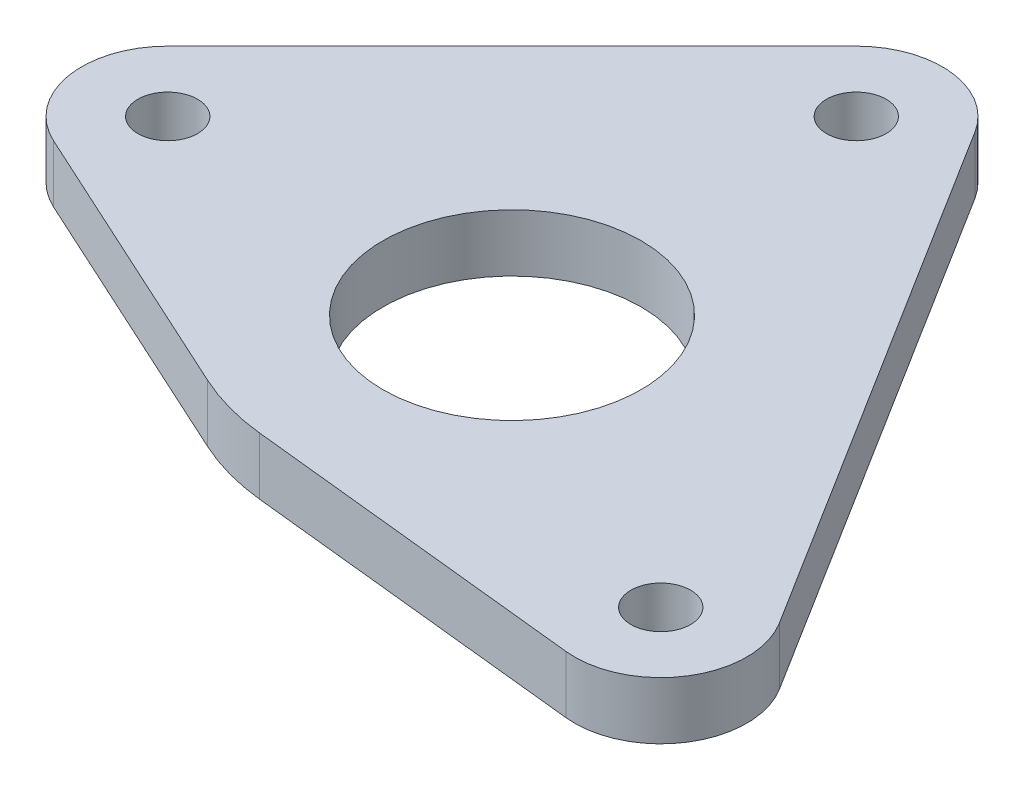
ISO-10303-21;
HEADER;
FILE_DESCRIPTION(('STEP AP214'),'2;1');
FILE_NAME('part.step','',(''),(''),'','','');
FILE_SCHEMA(('AUTOMOTIVE_DESIGN { 1 0 10303 214 1 1 1 1 }'));
ENDSEC;
DATA;
#1=APPLICATION_CONTEXT('core data for automotive mechanical design processes');
#2=APPLICATION_PROTOCOL_DEFINITION('international standard','automotive_design',2000,#1);
#3=PRODUCT_CONTEXT('',#1,'mechanical');
#4=PRODUCT('Part','Part','',(#3));
#5=PRODUCT_RELATED_PRODUCT_CATEGORY('part','',(#4));
#6=PRODUCT_DEFINITION_FORMATION('','',#4);
#7=PRODUCT_DEFINITION_CONTEXT('part definition',#1,'design');
#8=PRODUCT_DEFINITION('design','',#6,#7);
#9=PRODUCT_DEFINITION_SHAPE('','',#8);
#10=(LENGTH_UNIT() NAMED_UNIT(*) SI_UNIT(.MILLI.,.METRE.));
#11=(NAMED_UNIT(*) PLANE_ANGLE_UNIT() SI_UNIT($,.RADIAN.));
#12=(NAMED_UNIT(*) SI_UNIT($,.STERADIAN.) SOLID_ANGLE_UNIT());
#13=UNCERTAINTY_MEASURE_WITH_UNIT(LENGTH_MEASURE(1.E-05),#10,'distance_accuracy_value','');
#14=(GEOMETRIC_REPRESENTATION_CONTEXT(3) GLOBAL_UNCERTAINTY_ASSIGNED_CONTEXT((#13)) GLOBAL_UNIT_ASSIGNED_CONTEXT((#10,
#11,#12)) REPRESENTATION_CONTEXT('',''));
#15=CARTESIAN_POINT('',(0.,0.,0.));
#16=DIRECTION('',(0.,0.,1.));
#17=DIRECTION('',(1.,0.,0.));
#18=AXIS2_PLACEMENT_3D('',#15,#16,#17);
#19=CARTESIAN_POINT('',(533.11627146309,-57.15,450.990071462721));
#20=DIRECTION('',(0.,-1.,0.));
#21=DIRECTION('',(0.,0.,-1.));
#22=AXIS2_PLACEMENT_3D('',#19,#20,#21);
#23=PLANE('',#22);
#24=CARTESIAN_POINT('',(495.950567298665,-57.15,460.154340894014));
#25=DIRECTION('',(0.,-1.,0.));
#26=DIRECTION('',(0.,0.,-1.));
#27=AXIS2_PLACEMENT_3D('',#24,#25,#26);
#28=CIRCLE('',#27,9.525);
#29=CARTESIAN_POINT('',(491.981817298665,-57.15,468.813131135006));
#30=VERTEX_POINT('',#29);
#31=CARTESIAN_POINT('',(489.215375207863,-57.15,453.419148803212));
#32=VERTEX_POINT('',#31);
#33=EDGE_CURVE('E147',#30,#32,#28,.T.);
#34=ORIENTED_EDGE('',*,*,#33,.F.);
#35=DIRECTION('',(0.909059342886309,0.,0.416666666666668));
#36=VECTOR('',#35,1.);
#37=CARTESIAN_POINT('',(507.724525631999,-57.15,476.028789669166));
#38=LINE('',#37,#36);
#39=CARTESIAN_POINT('',(523.467233965332,-57.15,483.244448203326));
#40=VERTEX_POINT('',#39);
#41=EDGE_CURVE('E25',#30,#40,#38,.T.);
#42=ORIENTED_EDGE('',*,*,#41,.T.);
#43=CARTESIAN_POINT('',(534.050567298665,-57.15,460.154340894014));
#44=DIRECTION('',(0.,-1.,0.));
#45=DIRECTION('',(0.,0.,-1.));
#46=AXIS2_PLACEMENT_3D('',#43,#44,#45);
#47=CIRCLE('',#46,25.4);
#48=CARTESIAN_POINT('',(531.394922706726,-57.15,485.415131693221));
#49=VERTEX_POINT('',#48);
#50=EDGE_CURVE('E217',#49,#40,#47,.T.);
#51=ORIENTED_EDGE('',*,*,#50,.F.);
#52=DIRECTION('',(-0.994519322803428,0.,-0.104552936690518));
#53=VECTOR('',#52,1.);
#54=CARTESIAN_POINT('',(550.340515806131,-57.15,487.406865137175));
#55=LINE('',#54,#53);
#56=CARTESIAN_POINT('',(569.286108905537,-57.15,489.39859858113));
#57=VERTEX_POINT('',#56);
#58=EDGE_CURVE('E227',#57,#49,#55,.T.);
#59=ORIENTED_EDGE('',*,*,#58,.F.);
#60=CARTESIAN_POINT('',(570.281975627514,-57.15,479.925802031427));
#61=DIRECTION('',(0.,-1.,0.));
#62=DIRECTION('',(0.,0.,-1.));
#63=AXIS2_PLACEMENT_3D('',#60,#61,#62);
#64=CIRCLE('',#63,9.525);
#65=CARTESIAN_POINT('',(578.355285771646,-57.15,474.87136948992));
#66=VERTEX_POINT('',#65);
#67=EDGE_CURVE('E168',#66,#57,#64,.T.);
#68=ORIENTED_EDGE('',*,*,#67,.F.);
#69=DIRECTION('',(0.530649085722529,0.,0.847591616181899));
#70=VECTOR('',#69,1.);
#71=CARTESIAN_POINT('',(560.239581607222,-57.15,445.935638921214));
#72=LINE('',#71,#70);
#73=CARTESIAN_POINT('',(542.123877442798,-57.15,416.999908352507));
#74=VERTEX_POINT('',#73);
#75=EDGE_CURVE('E174',#74,#66,#72,.T.);
#76=ORIENTED_EDGE('',*,*,#75,.F.);
#77=CARTESIAN_POINT('',(534.050567298665,-57.15,422.054340894014));
#78=DIRECTION('',(0.,-1.,0.));
#79=DIRECTION('',(0.,0.,-1.));
#80=AXIS2_PLACEMENT_3D('',#77,#78,#79);
#81=CIRCLE('',#80,9.525);
#82=CARTESIAN_POINT('',(527.315375207863,-57.15,415.319148803212));
#83=VERTEX_POINT('',#82);
#84=EDGE_CURVE('E185',#83,#74,#81,.T.);
#85=ORIENTED_EDGE('',*,*,#84,.F.);
#86=DIRECTION('',(0.707106781186548,0.,-0.707106781186547));
#87=VECTOR('',#86,1.);
#88=CARTESIAN_POINT('',(508.265375207863,-57.15,434.369148803212));
#89=LINE('',#88,#87);
#90=EDGE_CURVE('E151',#32,#83,#89,.T.);
#91=ORIENTED_EDGE('',*,*,#90,.F.);
#92=EDGE_LOOP('',(#34,#42,#51,#59,#68,#76,#85,#91));
#93=FACE_BOUND('',#92,.T.);
#94=CARTESIAN_POINT('',(495.950567298665,-57.15,460.154340894014));
#95=DIRECTION('',(0.,-1.,0.));
#96=DIRECTION('',(0.,0.,-1.));
#97=AXIS2_PLACEMENT_3D('',#94,#95,#96);
#98=CIRCLE('',#97,3.302);
#99=CARTESIAN_POINT('',(495.950567298665,-57.15,456.852340894014));
#100=VERTEX_POINT('',#99);
#101=EDGE_CURVE('E216',#100,#100,#98,.T.);
#102=ORIENTED_EDGE('',*,*,#101,.T.);
#103=EDGE_LOOP('',(#102));
#104=FACE_BOUND('',#103,.T.);
#105=CARTESIAN_POINT('',(534.050567298665,-57.15,460.154340894014));
#106=DIRECTION('',(0.,-1.,0.));
#107=DIRECTION('',(0.,0.,-1.));
#108=AXIS2_PLACEMENT_3D('',#105,#106,#107);
#109=CIRCLE('',#108,14.2875);
#110=CARTESIAN_POINT('',(534.050567298665,-57.15,445.866840894014));
#111=VERTEX_POINT('',#110);
#112=EDGE_CURVE('E215',#111,#111,#109,.T.);
#113=ORIENTED_EDGE('',*,*,#112,.T.);
#114=EDGE_LOOP('',(#113));
#115=FACE_BOUND('',#114,.T.);
#116=CARTESIAN_POINT('',(534.050567298665,-57.15,422.054340894014));
#117=DIRECTION('',(0.,-1.,0.));
#118=DIRECTION('',(0.,0.,-1.));
#119=AXIS2_PLACEMENT_3D('',#116,#117,#118);
#120=CIRCLE('',#119,3.302);
#121=CARTESIAN_POINT('',(534.050567298665,-57.15,418.752340894014));
#122=VERTEX_POINT('',#121);
#123=EDGE_CURVE('E247',#122,#122,#120,.T.);
#124=ORIENTED_EDGE('',*,*,#123,.T.);
#125=EDGE_LOOP('',(#124));
#126=FACE_BOUND('',#125,.T.);
#127=CARTESIAN_POINT('',(570.281975627514,-57.15,479.925802031427));
#128=DIRECTION('',(0.,-1.,0.));
#129=DIRECTION('',(0.,0.,-1.));
#130=AXIS2_PLACEMENT_3D('',#127,#128,#129);
#131=CIRCLE('',#130,3.30199999999991);
#132=CARTESIAN_POINT('',(570.281975627514,-57.15,476.623802031427));
#133=VERTEX_POINT('',#132);
#134=EDGE_CURVE('E35',#133,#133,#131,.T.);
#135=ORIENTED_EDGE('',*,*,#134,.T.);
#136=EDGE_LOOP('',(#135));
#137=FACE_BOUND('',#136,.T.);
#138=ADVANCED_FACE('F17',(#93,#104,#115,#126,#137),#23,.F.);
#139=CARTESIAN_POINT('',(533.11627146309,-63.5,450.990071462721));
#140=DIRECTION('',(0.,-1.,0.));
#141=DIRECTION('',(0.,0.,-1.));
#142=AXIS2_PLACEMENT_3D('',#139,#140,#141);
#143=PLANE('',#142);
#144=CARTESIAN_POINT('',(495.950567298665,-63.5,460.154340894014));
#145=DIRECTION('',(0.,-1.,0.));
#146=DIRECTION('',(0.,0.,-1.));
#147=AXIS2_PLACEMENT_3D('',#144,#145,#146);
#148=CIRCLE('',#147,9.525);
#149=CARTESIAN_POINT('',(491.981817298665,-63.5,468.813131135006));
#150=VERTEX_POINT('',#149);
#151=CARTESIAN_POINT('',(489.215375207863,-63.5,453.419148803212));
#152=VERTEX_POINT('',#151);
#153=EDGE_CURVE('E149',#150,#152,#148,.T.);
#154=ORIENTED_EDGE('',*,*,#153,.T.);
#155=DIRECTION('',(0.707106781186548,0.,-0.707106781186547));
#156=VECTOR('',#155,1.);
#157=CARTESIAN_POINT('',(508.265375207863,-63.5,434.369148803212));
#158=LINE('',#157,#156);
#159=CARTESIAN_POINT('',(527.315375207863,-63.5,415.319148803212));
#160=VERTEX_POINT('',#159);
#161=EDGE_CURVE('E190',#152,#160,#158,.T.);
#162=ORIENTED_EDGE('',*,*,#161,.T.);
#163=CARTESIAN_POINT('',(534.050567298665,-63.5,422.054340894014));
#164=DIRECTION('',(0.,-1.,0.));
#165=DIRECTION('',(0.,0.,-1.));
#166=AXIS2_PLACEMENT_3D('',#163,#164,#165);
#167=CIRCLE('',#166,9.525);
#168=CARTESIAN_POINT('',(542.123877442798,-63.5,416.999908352507));
#169=VERTEX_POINT('',#168);
#170=EDGE_CURVE('E179',#160,#169,#167,.T.);
#171=ORIENTED_EDGE('',*,*,#170,.T.);
#172=DIRECTION('',(0.530649085722529,0.,0.847591616181899));
#173=VECTOR('',#172,1.);
#174=CARTESIAN_POINT('',(560.239581607222,-63.5,445.935638921214));
#175=LINE('',#174,#173);
#176=CARTESIAN_POINT('',(578.355285771646,-63.5,474.87136948992));
#177=VERTEX_POINT('',#176);
#178=EDGE_CURVE('E173',#169,#177,#175,.T.);
#179=ORIENTED_EDGE('',*,*,#178,.T.);
#180=CARTESIAN_POINT('',(570.281975627514,-63.5,479.925802031427));
#181=DIRECTION('',(0.,-1.,0.));
#182=DIRECTION('',(0.,0.,-1.));
#183=AXIS2_PLACEMENT_3D('',#180,#181,#182);
#184=CIRCLE('',#183,9.525);
#185=CARTESIAN_POINT('',(569.286108905537,-63.5,489.39859858113));
#186=VERTEX_POINT('',#185);
#187=EDGE_CURVE('E211',#177,#186,#184,.T.);
#188=ORIENTED_EDGE('',*,*,#187,.T.);
#189=DIRECTION('',(-0.994519322803428,0.,-0.104552936690518));
#190=VECTOR('',#189,1.);
#191=CARTESIAN_POINT('',(550.340515806131,-63.5,487.406865137175));
#192=LINE('',#191,#190);
#193=CARTESIAN_POINT('',(531.394922706726,-63.5,485.415131693221));
#194=VERTEX_POINT('',#193);
#195=EDGE_CURVE('E220',#186,#194,#192,.T.);
#196=ORIENTED_EDGE('',*,*,#195,.T.);
#197=CARTESIAN_POINT('',(534.050567298665,-63.5,460.154340894014));
#198=DIRECTION('',(0.,-1.,0.));
#199=DIRECTION('',(0.,0.,-1.));
#200=AXIS2_PLACEMENT_3D('',#197,#198,#199);
#201=CIRCLE('',#200,25.4);
#202=CARTESIAN_POINT('',(523.467233965332,-63.5,483.244448203326));
#203=VERTEX_POINT('',#202);
#204=EDGE_CURVE('E194',#194,#203,#201,.T.);
#205=ORIENTED_EDGE('',*,*,#204,.T.);
#206=DIRECTION('',(0.909059342886309,0.,0.416666666666668));
#207=VECTOR('',#206,1.);
#208=CARTESIAN_POINT('',(507.724525631999,-63.5,476.028789669166));
#209=LINE('',#208,#207);
#210=EDGE_CURVE('E11',#150,#203,#209,.T.);
#211=ORIENTED_EDGE('',*,*,#210,.F.);
#212=EDGE_LOOP('',(#154,#162,#171,#179,#188,#196,#205,#211));
#213=FACE_BOUND('',#212,.T.);
#214=CARTESIAN_POINT('',(495.950567298665,-63.5,460.154340894014));
#215=DIRECTION('',(0.,-1.,0.));
#216=DIRECTION('',(0.,0.,-1.));
#217=AXIS2_PLACEMENT_3D('',#214,#215,#216);
#218=CIRCLE('',#217,3.302);
#219=CARTESIAN_POINT('',(495.950567298665,-63.5,456.852340894014));
#220=VERTEX_POINT('',#219);
#221=EDGE_CURVE('E198',#220,#220,#218,.T.);
#222=ORIENTED_EDGE('',*,*,#221,.F.);
#223=EDGE_LOOP('',(#222));
#224=FACE_BOUND('',#223,.T.);
#225=CARTESIAN_POINT('',(534.050567298665,-63.5,460.154340894014));
#226=DIRECTION('',(0.,-1.,0.));
#227=DIRECTION('',(0.,0.,-1.));
#228=AXIS2_PLACEMENT_3D('',#225,#226,#227);
#229=CIRCLE('',#228,14.2875);
#230=CARTESIAN_POINT('',(534.050567298665,-63.5,445.866840894014));
#231=VERTEX_POINT('',#230);
#232=EDGE_CURVE('E212',#231,#231,#229,.T.);
#233=ORIENTED_EDGE('',*,*,#232,.F.);
#234=EDGE_LOOP('',(#233));
#235=FACE_BOUND('',#234,.T.);
#236=CARTESIAN_POINT('',(534.050567298665,-63.5,422.054340894014));
#237=DIRECTION('',(0.,-1.,0.));
#238=DIRECTION('',(0.,0.,-1.));
#239=AXIS2_PLACEMENT_3D('',#236,#237,#238);
#240=CIRCLE('',#239,3.302);
#241=CARTESIAN_POINT('',(534.050567298665,-63.5,418.752340894014));
#242=VERTEX_POINT('',#241);
#243=EDGE_CURVE('E244',#242,#242,#240,.T.);
#244=ORIENTED_EDGE('',*,*,#243,.F.);
#245=EDGE_LOOP('',(#244));
#246=FACE_BOUND('',#245,.T.);
#247=CARTESIAN_POINT('',(570.281975627514,-63.5,479.925802031427));
#248=DIRECTION('',(0.,-1.,0.));
#249=DIRECTION('',(0.,0.,-1.));
#250=AXIS2_PLACEMENT_3D('',#247,#248,#249);
#251=CIRCLE('',#250,3.30199999999991);
#252=CARTESIAN_POINT('',(570.281975627514,-63.5,476.623802031427));
#253=VERTEX_POINT('',#252);
#254=EDGE_CURVE('E42',#253,#253,#251,.T.);
#255=ORIENTED_EDGE('',*,*,#254,.F.);
#256=EDGE_LOOP('',(#255));
#257=FACE_BOUND('',#256,.T.);
#258=ADVANCED_FACE('F359',(#213,#224,#235,#246,#257),#143,.T.);
#259=CARTESIAN_POINT('',(507.724525631999,-63.5,476.028789669166));
#260=DIRECTION('',(-0.416666666666668,0.,0.909059342886309));
#261=DIRECTION('',(0.,1.,0.));
#262=AXIS2_PLACEMENT_3D('',#259,#260,#261);
#263=PLANE('',#262);
#264=ORIENTED_EDGE('',*,*,#41,.F.);
#265=DIRECTION('',(0.,1.,0.));
#266=VECTOR('',#265,1.);
#267=CARTESIAN_POINT('',(491.981817298665,-63.5,468.813131135006));
#268=LINE('',#267,#266);
#269=EDGE_CURVE('E135',#150,#30,#268,.T.);
#270=ORIENTED_EDGE('',*,*,#269,.F.);
#271=ORIENTED_EDGE('',*,*,#210,.T.);
#272=DIRECTION('',(0.,1.,0.));
#273=VECTOR('',#272,1.);
#274=CARTESIAN_POINT('',(523.467233965332,-63.5,483.244448203326));
#275=LINE('',#274,#273);
#276=EDGE_CURVE('E138',#203,#40,#275,.T.);
#277=ORIENTED_EDGE('',*,*,#276,.T.);
#278=EDGE_LOOP('',(#264,#270,#271,#277));
#279=FACE_BOUND('',#278,.T.);
#280=ADVANCED_FACE('F134',(#279),#263,.T.);
#281=CARTESIAN_POINT('',(570.281975627514,-63.5,479.925802031427));
#282=DIRECTION('',(0.,1.,0.));
#283=DIRECTION('',(0.,0.,1.));
#284=AXIS2_PLACEMENT_3D('',#281,#282,#283);
#285=CYLINDRICAL_SURFACE('',#284,3.30199999999991);
#286=ORIENTED_EDGE('',*,*,#134,.F.);
#287=EDGE_LOOP('',(#286));
#288=FACE_BOUND('',#287,.T.);
#289=ORIENTED_EDGE('',*,*,#254,.T.);
#290=EDGE_LOOP('',(#289));
#291=FACE_BOUND('',#290,.T.);
#292=ADVANCED_FACE('F260',(#288,#291),#285,.F.);
#293=CARTESIAN_POINT('',(534.050567298665,-63.5,422.054340894014));
#294=DIRECTION('',(0.,1.,0.));
#295=DIRECTION('',(0.,0.,1.));
#296=AXIS2_PLACEMENT_3D('',#293,#294,#295);
#297=CYLINDRICAL_SURFACE('',#296,3.302);
#298=ORIENTED_EDGE('',*,*,#123,.F.);
#299=EDGE_LOOP('',(#298));
#300=FACE_BOUND('',#299,.T.);
#301=ORIENTED_EDGE('',*,*,#243,.T.);
#302=EDGE_LOOP('',(#301));
#303=FACE_BOUND('',#302,.T.);
#304=ADVANCED_FACE('F265',(#300,#303),#297,.F.);
#305=CARTESIAN_POINT('',(534.050567298665,-63.5,460.154340894014));
#306=DIRECTION('',(0.,1.,0.));
#307=DIRECTION('',(0.,0.,1.));
#308=AXIS2_PLACEMENT_3D('',#305,#306,#307);
#309=CYLINDRICAL_SURFACE('',#308,14.2875);
#310=ORIENTED_EDGE('',*,*,#112,.F.);
#311=EDGE_LOOP('',(#310));
#312=FACE_BOUND('',#311,.T.);
#313=ORIENTED_EDGE('',*,*,#232,.T.);
#314=EDGE_LOOP('',(#313));
#315=FACE_BOUND('',#314,.T.);
#316=ADVANCED_FACE('F339',(#312,#315),#309,.F.);
#317=CARTESIAN_POINT('',(495.950567298665,-63.5,460.154340894014));
#318=DIRECTION('',(0.,1.,0.));
#319=DIRECTION('',(0.,0.,1.));
#320=AXIS2_PLACEMENT_3D('',#317,#318,#319);
#321=CYLINDRICAL_SURFACE('',#320,3.302);
#322=ORIENTED_EDGE('',*,*,#101,.F.);
#323=EDGE_LOOP('',(#322));
#324=FACE_BOUND('',#323,.T.);
#325=ORIENTED_EDGE('',*,*,#221,.T.);
#326=EDGE_LOOP('',(#325));
#327=FACE_BOUND('',#326,.T.);
#328=ADVANCED_FACE('F330',(#324,#327),#321,.F.);
#329=CARTESIAN_POINT('',(534.050567298665,-63.5,460.154340894014));
#330=DIRECTION('',(0.,1.,0.));
#331=DIRECTION('',(0.,0.,1.));
#332=AXIS2_PLACEMENT_3D('',#329,#330,#331);
#333=CYLINDRICAL_SURFACE('',#332,25.4);
#334=ORIENTED_EDGE('',*,*,#50,.T.);
#335=ORIENTED_EDGE('',*,*,#276,.F.);
#336=ORIENTED_EDGE('',*,*,#204,.F.);
#337=DIRECTION('',(0.,1.,0.));
#338=VECTOR('',#337,1.);
#339=CARTESIAN_POINT('',(531.394922706726,-63.5,485.415131693221));
#340=LINE('',#339,#338);
#341=EDGE_CURVE('E231',#194,#49,#340,.T.);
#342=ORIENTED_EDGE('',*,*,#341,.T.);
#343=EDGE_LOOP('',(#334,#335,#336,#342));
#344=FACE_BOUND('',#343,.T.);
#345=ADVANCED_FACE('F321',(#344),#333,.T.);
#346=CARTESIAN_POINT('',(550.340515806131,-63.5,487.406865137175));
#347=DIRECTION('',(0.104552936690518,0.,-0.994519322803428));
#348=DIRECTION('',(0.,-1.,0.));
#349=AXIS2_PLACEMENT_3D('',#346,#347,#348);
#350=PLANE('',#349);
#351=ORIENTED_EDGE('',*,*,#58,.T.);
#352=ORIENTED_EDGE('',*,*,#341,.F.);
#353=ORIENTED_EDGE('',*,*,#195,.F.);
#354=DIRECTION('',(0.,1.,0.));
#355=VECTOR('',#354,1.);
#356=CARTESIAN_POINT('',(569.286108905537,-63.5,489.39859858113));
#357=LINE('',#356,#355);
#358=EDGE_CURVE('E172',#186,#57,#357,.T.);
#359=ORIENTED_EDGE('',*,*,#358,.T.);
#360=EDGE_LOOP('',(#351,#352,#353,#359));
#361=FACE_BOUND('',#360,.T.);
#362=ADVANCED_FACE('F312',(#361),#350,.F.);
#363=CARTESIAN_POINT('',(570.281975627514,-63.5,479.925802031427));
#364=DIRECTION('',(0.,1.,0.));
#365=DIRECTION('',(0.,0.,1.));
#366=AXIS2_PLACEMENT_3D('',#363,#364,#365);
#367=CYLINDRICAL_SURFACE('',#366,9.525);
#368=ORIENTED_EDGE('',*,*,#67,.T.);
#369=ORIENTED_EDGE('',*,*,#358,.F.);
#370=ORIENTED_EDGE('',*,*,#187,.F.);
#371=DIRECTION('',(0.,1.,0.));
#372=VECTOR('',#371,1.);
#373=CARTESIAN_POINT('',(578.355285771646,-63.5,474.87136948992));
#374=LINE('',#373,#372);
#375=EDGE_CURVE('E178',#177,#66,#374,.T.);
#376=ORIENTED_EDGE('',*,*,#375,.T.);
#377=EDGE_LOOP('',(#368,#369,#370,#376));
#378=FACE_BOUND('',#377,.T.);
#379=ADVANCED_FACE('F303',(#378),#367,.T.);
#380=CARTESIAN_POINT('',(560.239581607222,-63.5,445.935638921214));
#381=DIRECTION('',(-0.847591616181899,0.,0.530649085722529));
#382=DIRECTION('',(0.,1.,0.));
#383=AXIS2_PLACEMENT_3D('',#380,#381,#382);
#384=PLANE('',#383);
#385=ORIENTED_EDGE('',*,*,#75,.T.);
#386=ORIENTED_EDGE('',*,*,#375,.F.);
#387=ORIENTED_EDGE('',*,*,#178,.F.);
#388=DIRECTION('',(0.,1.,0.));
#389=VECTOR('',#388,1.);
#390=CARTESIAN_POINT('',(542.123877442798,-63.5,416.999908352507));
#391=LINE('',#390,#389);
#392=EDGE_CURVE('E189',#169,#74,#391,.T.);
#393=ORIENTED_EDGE('',*,*,#392,.T.);
#394=EDGE_LOOP('',(#385,#386,#387,#393));
#395=FACE_BOUND('',#394,.T.);
#396=ADVANCED_FACE('F294',(#395),#384,.F.);
#397=CARTESIAN_POINT('',(534.050567298665,-63.5,422.054340894014));
#398=DIRECTION('',(0.,1.,0.));
#399=DIRECTION('',(0.,0.,1.));
#400=AXIS2_PLACEMENT_3D('',#397,#398,#399);
#401=CYLINDRICAL_SURFACE('',#400,9.525);
#402=ORIENTED_EDGE('',*,*,#84,.T.);
#403=ORIENTED_EDGE('',*,*,#392,.F.);
#404=ORIENTED_EDGE('',*,*,#170,.F.);
#405=DIRECTION('',(0.,1.,0.));
#406=VECTOR('',#405,1.);
#407=CARTESIAN_POINT('',(527.315375207863,-63.5,415.319148803212));
#408=LINE('',#407,#406);
#409=EDGE_CURVE('E164',#160,#83,#408,.T.);
#410=ORIENTED_EDGE('',*,*,#409,.T.);
#411=EDGE_LOOP('',(#402,#403,#404,#410));
#412=FACE_BOUND('',#411,.T.);
#413=ADVANCED_FACE('F285',(#412),#401,.T.);
#414=CARTESIAN_POINT('',(508.265375207863,-63.5,434.369148803212));
#415=DIRECTION('',(0.707106781186547,0.,0.707106781186548));
#416=DIRECTION('',(0.,-1.,0.));
#417=AXIS2_PLACEMENT_3D('',#414,#415,#416);
#418=PLANE('',#417);
#419=ORIENTED_EDGE('',*,*,#90,.T.);
#420=ORIENTED_EDGE('',*,*,#409,.F.);
#421=ORIENTED_EDGE('',*,*,#161,.F.);
#422=DIRECTION('',(0.,1.,0.));
#423=VECTOR('',#422,1.);
#424=CARTESIAN_POINT('',(489.215375207863,-63.5,453.419148803212));
#425=LINE('',#424,#423);
#426=EDGE_CURVE('E157',#152,#32,#425,.T.);
#427=ORIENTED_EDGE('',*,*,#426,.T.);
#428=EDGE_LOOP('',(#419,#420,#421,#427));
#429=FACE_BOUND('',#428,.T.);
#430=ADVANCED_FACE('F277',(#429),#418,.F.);
#431=CARTESIAN_POINT('',(495.950567298665,-63.5,460.154340894014));
#432=DIRECTION('',(0.,1.,0.));
#433=DIRECTION('',(0.,0.,1.));
#434=AXIS2_PLACEMENT_3D('',#431,#432,#433);
#435=CYLINDRICAL_SURFACE('',#434,9.525);
#436=ORIENTED_EDGE('',*,*,#33,.T.);
#437=ORIENTED_EDGE('',*,*,#426,.F.);
#438=ORIENTED_EDGE('',*,*,#153,.F.);
#439=ORIENTED_EDGE('',*,*,#269,.T.);
#440=EDGE_LOOP('',(#436,#437,#438,#439));
#441=FACE_BOUND('',#440,.T.);
#442=ADVANCED_FACE('F145',(#441),#435,.T.);
#443=CLOSED_SHELL('',(#138,#258,#280,#292,#304,#316,#328,#345,#362,#379,#396,#413,#430,#442));
#444=MANIFOLD_SOLID_BREP('B1',#443);
#445=ADVANCED_BREP_SHAPE_REPRESENTATION('',(#18,#444),#14);
#446=SHAPE_DEFINITION_REPRESENTATION(#9,#445);
ENDSEC;
END-ISO-10303-21;
